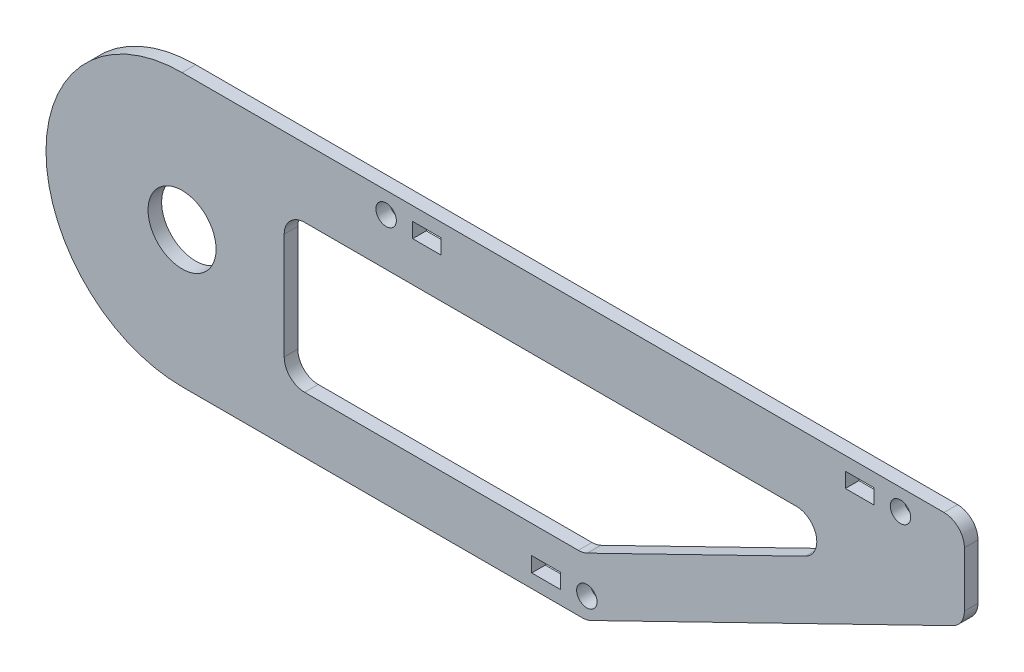
ISO-10303-21;
HEADER;
FILE_DESCRIPTION(('STEP AP214'),'2;1');
FILE_NAME('part.step','',(''),(''),'','','');
FILE_SCHEMA(('AUTOMOTIVE_DESIGN { 1 0 10303 214 1 1 1 1 }'));
ENDSEC;
DATA;
#1=APPLICATION_CONTEXT('core data for automotive mechanical design processes');
#2=APPLICATION_PROTOCOL_DEFINITION('international standard','automotive_design',2000,#1);
#3=PRODUCT_CONTEXT('',#1,'mechanical');
#4=PRODUCT('Part','Part','',(#3));
#5=PRODUCT_RELATED_PRODUCT_CATEGORY('part','',(#4));
#6=PRODUCT_DEFINITION_FORMATION('','',#4);
#7=PRODUCT_DEFINITION_CONTEXT('part definition',#1,'design');
#8=PRODUCT_DEFINITION('design','',#6,#7);
#9=PRODUCT_DEFINITION_SHAPE('','',#8);
#10=(LENGTH_UNIT() NAMED_UNIT(*) SI_UNIT(.MILLI.,.METRE.));
#11=(NAMED_UNIT(*) PLANE_ANGLE_UNIT() SI_UNIT($,.RADIAN.));
#12=(NAMED_UNIT(*) SI_UNIT($,.STERADIAN.) SOLID_ANGLE_UNIT());
#13=UNCERTAINTY_MEASURE_WITH_UNIT(LENGTH_MEASURE(1.E-05),#10,'distance_accuracy_value','');
#14=(GEOMETRIC_REPRESENTATION_CONTEXT(3) GLOBAL_UNCERTAINTY_ASSIGNED_CONTEXT((#13)) GLOBAL_UNIT_ASSIGNED_CONTEXT((#10,
#11,#12)) REPRESENTATION_CONTEXT('',''));
#15=CARTESIAN_POINT('',(0.,0.,0.));
#16=DIRECTION('',(0.,0.,1.));
#17=DIRECTION('',(1.,0.,0.));
#18=AXIS2_PLACEMENT_3D('',#15,#16,#17);
#19=CARTESIAN_POINT('',(0.,0.,2.));
#20=DIRECTION('',(0.,0.,-1.));
#21=DIRECTION('',(-1.,0.,0.));
#22=AXIS2_PLACEMENT_3D('',#19,#20,#21);
#23=PLANE('',#22);
#24=CARTESIAN_POINT('',(59.5,-16.9,2.));
#25=DIRECTION('',(0.,0.,1.));
#26=DIRECTION('',(1.,0.,0.));
#27=AXIS2_PLACEMENT_3D('',#24,#25,#26);
#28=CIRCLE('',#27,1.50000000000003);
#29=CARTESIAN_POINT('',(61.,-16.9,2.));
#30=VERTEX_POINT('',#29);
#31=EDGE_CURVE('E257',#30,#30,#28,.T.);
#32=ORIENTED_EDGE('',*,*,#31,.F.);
#33=EDGE_LOOP('',(#32));
#34=FACE_BOUND('',#33,.T.);
#35=DIRECTION('',(0.,-1.,0.));
#36=VECTOR('',#35,1.);
#37=CARTESIAN_POINT('',(33.9000000000001,18.,2.));
#38=LINE('',#37,#36);
#39=CARTESIAN_POINT('',(33.9000000000001,18.,2.));
#40=VERTEX_POINT('',#39);
#41=CARTESIAN_POINT('',(33.9000000000001,15.8,2.));
#42=VERTEX_POINT('',#41);
#43=EDGE_CURVE('E263',#40,#42,#38,.T.);
#44=ORIENTED_EDGE('',*,*,#43,.F.);
#45=DIRECTION('',(-1.,0.,0.));
#46=VECTOR('',#45,1.);
#47=CARTESIAN_POINT('',(33.9000000000001,18.,2.));
#48=LINE('',#47,#46);
#49=CARTESIAN_POINT('',(38.1,18.,2.));
#50=VERTEX_POINT('',#49);
#51=EDGE_CURVE('E271',#50,#40,#48,.T.);
#52=ORIENTED_EDGE('',*,*,#51,.F.);
#53=DIRECTION('',(0.,1.,0.));
#54=VECTOR('',#53,1.);
#55=CARTESIAN_POINT('',(38.1,18.,2.));
#56=LINE('',#55,#54);
#57=CARTESIAN_POINT('',(38.1,15.8,2.));
#58=VERTEX_POINT('',#57);
#59=EDGE_CURVE('E268',#58,#50,#56,.T.);
#60=ORIENTED_EDGE('',*,*,#59,.F.);
#61=DIRECTION('',(1.,0.,0.));
#62=VECTOR('',#61,1.);
#63=CARTESIAN_POINT('',(33.9000000000001,15.8,2.));
#64=LINE('',#63,#62);
#65=EDGE_CURVE('E265',#42,#58,#64,.T.);
#66=ORIENTED_EDGE('',*,*,#65,.F.);
#67=EDGE_LOOP('',(#44,#52,#60,#66));
#68=FACE_BOUND('',#67,.T.);
#69=CARTESIAN_POINT('',(105.6,16.9,2.));
#70=DIRECTION('',(0.,0.,1.));
#71=DIRECTION('',(-1.,0.,0.));
#72=AXIS2_PLACEMENT_3D('',#69,#70,#71);
#73=CIRCLE('',#72,1.50000000000003);
#74=CARTESIAN_POINT('',(104.1,16.9,2.));
#75=VERTEX_POINT('',#74);
#76=EDGE_CURVE('E331',#75,#75,#73,.T.);
#77=ORIENTED_EDGE('',*,*,#76,.F.);
#78=EDGE_LOOP('',(#77));
#79=FACE_BOUND('',#78,.T.);
#80=CARTESIAN_POINT('',(58.2526580542473,-8.69741400655029,2.));
#81=DIRECTION('',(0.,0.,1.));
#82=DIRECTION('',(-1.,0.,0.));
#83=AXIS2_PLACEMENT_3D('',#80,#81,#82);
#84=CIRCLE('',#83,3.);
#85=CARTESIAN_POINT('',(58.2526580542473,-11.6974140065503,2.));
#86=VERTEX_POINT('',#85);
#87=CARTESIAN_POINT('',(59.5675454491414,-11.3939063834631,2.));
#88=VERTEX_POINT('',#87);
#89=EDGE_CURVE('E337',#86,#88,#84,.T.);
#90=ORIENTED_EDGE('',*,*,#89,.F.);
#91=DIRECTION('',(1.,0.,0.));
#92=VECTOR('',#91,1.);
#93=CARTESIAN_POINT('',(18.0131277478828,-11.6974140065503,2.));
#94=LINE('',#93,#92);
#95=CARTESIAN_POINT('',(18.0131277478828,-11.6974140065503,2.));
#96=VERTEX_POINT('',#95);
#97=EDGE_CURVE('E353',#96,#86,#94,.T.);
#98=ORIENTED_EDGE('',*,*,#97,.F.);
#99=CARTESIAN_POINT('',(18.0131277478828,-8.69741400655029,2.));
#100=DIRECTION('',(0.,0.,1.));
#101=DIRECTION('',(1.,0.,0.));
#102=AXIS2_PLACEMENT_3D('',#99,#100,#101);
#103=CIRCLE('',#102,3.);
#104=CARTESIAN_POINT('',(15.0131277478828,-8.69741400655027,2.));
#105=VERTEX_POINT('',#104);
#106=EDGE_CURVE('E350',#105,#96,#103,.T.);
#107=ORIENTED_EDGE('',*,*,#106,.F.);
#108=DIRECTION('',(0.,-1.,0.));
#109=VECTOR('',#108,1.);
#110=CARTESIAN_POINT('',(15.0131277478828,6.93156783963113,2.));
#111=LINE('',#110,#109);
#112=CARTESIAN_POINT('',(15.0131277478828,6.93156783963113,2.));
#113=VERTEX_POINT('',#112);
#114=EDGE_CURVE('E348',#113,#105,#111,.T.);
#115=ORIENTED_EDGE('',*,*,#114,.F.);
#116=CARTESIAN_POINT('',(18.0131277478828,6.93156783963115,2.));
#117=DIRECTION('',(0.,0.,1.));
#118=DIRECTION('',(-1.,0.,0.));
#119=AXIS2_PLACEMENT_3D('',#116,#117,#118);
#120=CIRCLE('',#119,3.);
#121=CARTESIAN_POINT('',(18.0131277478828,9.93156783963115,2.));
#122=VERTEX_POINT('',#121);
#123=EDGE_CURVE('E346',#122,#113,#120,.T.);
#124=ORIENTED_EDGE('',*,*,#123,.F.);
#125=DIRECTION('',(-1.,0.,0.));
#126=VECTOR('',#125,1.);
#127=CARTESIAN_POINT('',(90.3036386711331,9.93156783963116,2.));
#128=LINE('',#127,#126);
#129=CARTESIAN_POINT('',(90.3036386711331,9.93156783963116,2.));
#130=VERTEX_POINT('',#129);
#131=EDGE_CURVE('E344',#130,#122,#128,.T.);
#132=ORIENTED_EDGE('',*,*,#131,.F.);
#133=CARTESIAN_POINT('',(90.3036386711333,6.93156783963116,2.));
#134=DIRECTION('',(0.,0.,1.));
#135=DIRECTION('',(1.,0.,0.));
#136=AXIS2_PLACEMENT_3D('',#133,#134,#135);
#137=CIRCLE('',#136,3.);
#138=CARTESIAN_POINT('',(91.6185260660271,4.23507546271829,2.));
#139=VERTEX_POINT('',#138);
#140=EDGE_CURVE('E342',#139,#130,#137,.T.);
#141=ORIENTED_EDGE('',*,*,#140,.F.);
#142=DIRECTION('',(0.898830792304262,0.438295798298014,0.));
#143=VECTOR('',#142,1.);
#144=CARTESIAN_POINT('',(59.5675454491414,-11.3939063834631,2.));
#145=LINE('',#144,#143);
#146=EDGE_CURVE('E339',#88,#139,#145,.T.);
#147=ORIENTED_EDGE('',*,*,#146,.F.);
#148=EDGE_LOOP('',(#90,#98,#107,#115,#124,#132,#141,#147));
#149=FACE_BOUND('',#148,.T.);
#150=CARTESIAN_POINT('',(0.,0.,2.));
#151=DIRECTION('',(0.,0.,1.));
#152=DIRECTION('',(-1.,0.,0.));
#153=AXIS2_PLACEMENT_3D('',#150,#151,#152);
#154=CIRCLE('',#153,20.);
#155=CARTESIAN_POINT('',(0.,20.,2.));
#156=VERTEX_POINT('',#155);
#157=CARTESIAN_POINT('',(0.,-20.,2.));
#158=VERTEX_POINT('',#157);
#159=EDGE_CURVE('E402',#156,#158,#154,.T.);
#160=ORIENTED_EDGE('',*,*,#159,.T.);
#161=DIRECTION('',(1.,0.,0.));
#162=VECTOR('',#161,1.);
#163=CARTESIAN_POINT('',(0.,-20.,2.));
#164=LINE('',#163,#162);
#165=CARTESIAN_POINT('',(58.8075278744039,-20.,2.));
#166=VERTEX_POINT('',#165);
#167=EDGE_CURVE('E405',#158,#166,#164,.T.);
#168=ORIENTED_EDGE('',*,*,#167,.T.);
#169=CARTESIAN_POINT('',(58.8075278744039,-17.,2.));
#170=DIRECTION('',(0.,0.,1.));
#171=DIRECTION('',(1.,0.,0.));
#172=AXIS2_PLACEMENT_3D('',#169,#170,#171);
#173=CIRCLE('',#172,3.);
#174=CARTESIAN_POINT('',(60.122415269298,-19.6964923769128,2.));
#175=VERTEX_POINT('',#174);
#176=EDGE_CURVE('E408',#166,#175,#173,.T.);
#177=ORIENTED_EDGE('',*,*,#176,.T.);
#178=DIRECTION('',(0.898830792304262,0.438295798298014,0.));
#179=VECTOR('',#178,1.);
#180=CARTESIAN_POINT('',(60.122415269298,-19.6964923769128,2.));
#181=LINE('',#180,#179);
#182=CARTESIAN_POINT('',(113.314887394894,6.24169001886898,2.));
#183=VERTEX_POINT('',#182);
#184=EDGE_CURVE('E410',#175,#183,#181,.T.);
#185=ORIENTED_EDGE('',*,*,#184,.T.);
#186=CARTESIAN_POINT('',(112.,8.93818239578177,2.));
#187=DIRECTION('',(0.,0.,1.));
#188=DIRECTION('',(-1.,0.,0.));
#189=AXIS2_PLACEMENT_3D('',#186,#187,#188);
#190=CIRCLE('',#189,3.);
#191=CARTESIAN_POINT('',(115.,8.93818239578179,2.));
#192=VERTEX_POINT('',#191);
#193=EDGE_CURVE('E412',#183,#192,#190,.T.);
#194=ORIENTED_EDGE('',*,*,#193,.T.);
#195=DIRECTION('',(0.,1.,0.));
#196=VECTOR('',#195,1.);
#197=CARTESIAN_POINT('',(115.,8.93818239578179,2.));
#198=LINE('',#197,#196);
#199=CARTESIAN_POINT('',(115.,17.,2.));
#200=VERTEX_POINT('',#199);
#201=EDGE_CURVE('E414',#192,#200,#198,.T.);
#202=ORIENTED_EDGE('',*,*,#201,.T.);
#203=CARTESIAN_POINT('',(112.,17.,2.));
#204=DIRECTION('',(0.,0.,1.));
#205=DIRECTION('',(1.,0.,0.));
#206=AXIS2_PLACEMENT_3D('',#203,#204,#205);
#207=CIRCLE('',#206,3.);
#208=CARTESIAN_POINT('',(112.,20.,2.));
#209=VERTEX_POINT('',#208);
#210=EDGE_CURVE('E416',#200,#209,#207,.T.);
#211=ORIENTED_EDGE('',*,*,#210,.T.);
#212=DIRECTION('',(-1.,0.,0.));
#213=VECTOR('',#212,1.);
#214=CARTESIAN_POINT('',(0.,20.,2.));
#215=LINE('',#214,#213);
#216=EDGE_CURVE('E418',#209,#156,#215,.T.);
#217=ORIENTED_EDGE('',*,*,#216,.T.);
#218=EDGE_LOOP('',(#160,#168,#177,#185,#194,#202,#211,#217));
#219=FACE_BOUND('',#218,.T.);
#220=CARTESIAN_POINT('',(0.,0.,2.));
#221=DIRECTION('',(0.,0.,1.));
#222=DIRECTION('',(1.,0.,0.));
#223=AXIS2_PLACEMENT_3D('',#220,#221,#222);
#224=CIRCLE('',#223,5.);
#225=CARTESIAN_POINT('',(5.,0.,2.));
#226=VERTEX_POINT('',#225);
#227=EDGE_CURVE('E396',#226,#226,#224,.T.);
#228=ORIENTED_EDGE('',*,*,#227,.F.);
#229=EDGE_LOOP('',(#228));
#230=FACE_BOUND('',#229,.T.);
#231=DIRECTION('',(0.,1.,0.));
#232=VECTOR('',#231,1.);
#233=CARTESIAN_POINT('',(101.7,15.8,2.));
#234=LINE('',#233,#232);
#235=CARTESIAN_POINT('',(101.7,15.8,2.));
#236=VERTEX_POINT('',#235);
#237=CARTESIAN_POINT('',(101.7,18.,2.));
#238=VERTEX_POINT('',#237);
#239=EDGE_CURVE('E300',#236,#238,#234,.T.);
#240=ORIENTED_EDGE('',*,*,#239,.F.);
#241=DIRECTION('',(1.,0.,0.));
#242=VECTOR('',#241,1.);
#243=CARTESIAN_POINT('',(101.7,15.8,2.));
#244=LINE('',#243,#242);
#245=CARTESIAN_POINT('',(97.5,15.8,2.));
#246=VERTEX_POINT('',#245);
#247=EDGE_CURVE('E308',#246,#236,#244,.T.);
#248=ORIENTED_EDGE('',*,*,#247,.F.);
#249=DIRECTION('',(0.,-1.,0.));
#250=VECTOR('',#249,1.);
#251=CARTESIAN_POINT('',(97.5,15.8,2.));
#252=LINE('',#251,#250);
#253=CARTESIAN_POINT('',(97.4999999999999,18.,2.));
#254=VERTEX_POINT('',#253);
#255=EDGE_CURVE('E305',#254,#246,#252,.T.);
#256=ORIENTED_EDGE('',*,*,#255,.F.);
#257=DIRECTION('',(-1.,0.,0.));
#258=VECTOR('',#257,1.);
#259=CARTESIAN_POINT('',(101.7,18.,2.));
#260=LINE('',#259,#258);
#261=EDGE_CURVE('E302',#238,#254,#260,.T.);
#262=ORIENTED_EDGE('',*,*,#261,.F.);
#263=EDGE_LOOP('',(#240,#248,#256,#262));
#264=FACE_BOUND('',#263,.T.);
#265=CARTESIAN_POINT('',(30.,16.9,2.));
#266=DIRECTION('',(0.,0.,1.));
#267=DIRECTION('',(-1.,0.,0.));
#268=AXIS2_PLACEMENT_3D('',#265,#266,#267);
#269=CIRCLE('',#268,1.50000000000002);
#270=CARTESIAN_POINT('',(28.5,16.9,2.));
#271=VERTEX_POINT('',#270);
#272=EDGE_CURVE('E294',#271,#271,#269,.T.);
#273=ORIENTED_EDGE('',*,*,#272,.F.);
#274=EDGE_LOOP('',(#273));
#275=FACE_BOUND('',#274,.T.);
#276=DIRECTION('',(-1.,0.,0.));
#277=VECTOR('',#276,1.);
#278=CARTESIAN_POINT('',(55.5999999999999,-15.8,2.));
#279=LINE('',#278,#277);
#280=CARTESIAN_POINT('',(55.5999999999999,-15.8,2.));
#281=VERTEX_POINT('',#280);
#282=CARTESIAN_POINT('',(51.4,-15.8,2.));
#283=VERTEX_POINT('',#282);
#284=EDGE_CURVE('E221',#281,#283,#279,.T.);
#285=ORIENTED_EDGE('',*,*,#284,.F.);
#286=DIRECTION('',(0.,1.,0.));
#287=VECTOR('',#286,1.);
#288=CARTESIAN_POINT('',(55.5999999999999,-15.8,2.));
#289=LINE('',#288,#287);
#290=CARTESIAN_POINT('',(55.5999999999999,-18.,2.));
#291=VERTEX_POINT('',#290);
#292=EDGE_CURVE('E243',#291,#281,#289,.T.);
#293=ORIENTED_EDGE('',*,*,#292,.F.);
#294=DIRECTION('',(1.,0.,0.));
#295=VECTOR('',#294,1.);
#296=CARTESIAN_POINT('',(55.5999999999999,-18.,2.));
#297=LINE('',#296,#295);
#298=CARTESIAN_POINT('',(51.4,-18.,2.));
#299=VERTEX_POINT('',#298);
#300=EDGE_CURVE('E241',#299,#291,#297,.T.);
#301=ORIENTED_EDGE('',*,*,#300,.F.);
#302=DIRECTION('',(0.,-1.,0.));
#303=VECTOR('',#302,1.);
#304=CARTESIAN_POINT('',(51.4,-15.8,2.));
#305=LINE('',#304,#303);
#306=EDGE_CURVE('E229',#283,#299,#305,.T.);
#307=ORIENTED_EDGE('',*,*,#306,.F.);
#308=EDGE_LOOP('',(#285,#293,#301,#307));
#309=FACE_BOUND('',#308,.T.);
#310=ADVANCED_FACE('F36',(#34,#68,#79,#149,#219,#230,#264,#275,#309),#23,.F.);
#311=CARTESIAN_POINT('',(0.,0.,0.));
#312=DIRECTION('',(0.,0.,-1.));
#313=DIRECTION('',(-1.,0.,0.));
#314=AXIS2_PLACEMENT_3D('',#311,#312,#313);
#315=PLANE('',#314);
#316=DIRECTION('',(-1.,0.,0.));
#317=VECTOR('',#316,1.);
#318=CARTESIAN_POINT('',(33.9000000000001,18.,0.));
#319=LINE('',#318,#317);
#320=CARTESIAN_POINT('',(38.1,18.,0.));
#321=VERTEX_POINT('',#320);
#322=CARTESIAN_POINT('',(33.9000000000001,18.,0.));
#323=VERTEX_POINT('',#322);
#324=EDGE_CURVE('E266',#321,#323,#319,.T.);
#325=ORIENTED_EDGE('',*,*,#324,.T.);
#326=DIRECTION('',(0.,-1.,0.));
#327=VECTOR('',#326,1.);
#328=CARTESIAN_POINT('',(33.9000000000001,18.,0.));
#329=LINE('',#328,#327);
#330=CARTESIAN_POINT('',(33.9000000000001,15.8,0.));
#331=VERTEX_POINT('',#330);
#332=EDGE_CURVE('E260',#323,#331,#329,.T.);
#333=ORIENTED_EDGE('',*,*,#332,.T.);
#334=DIRECTION('',(1.,0.,0.));
#335=VECTOR('',#334,1.);
#336=CARTESIAN_POINT('',(33.9000000000001,15.8,0.));
#337=LINE('',#336,#335);
#338=CARTESIAN_POINT('',(38.1,15.8,0.));
#339=VERTEX_POINT('',#338);
#340=EDGE_CURVE('E276',#331,#339,#337,.T.);
#341=ORIENTED_EDGE('',*,*,#340,.T.);
#342=DIRECTION('',(0.,1.,0.));
#343=VECTOR('',#342,1.);
#344=CARTESIAN_POINT('',(38.1,18.,0.));
#345=LINE('',#344,#343);
#346=EDGE_CURVE('E279',#339,#321,#345,.T.);
#347=ORIENTED_EDGE('',*,*,#346,.T.);
#348=EDGE_LOOP('',(#325,#333,#341,#347));
#349=FACE_BOUND('',#348,.T.);
#350=CARTESIAN_POINT('',(30.,16.9,0.));
#351=DIRECTION('',(0.,0.,1.));
#352=DIRECTION('',(-1.,0.,0.));
#353=AXIS2_PLACEMENT_3D('',#350,#351,#352);
#354=CIRCLE('',#353,1.50000000000002);
#355=CARTESIAN_POINT('',(28.5,16.9,0.));
#356=VERTEX_POINT('',#355);
#357=EDGE_CURVE('E293',#356,#356,#354,.T.);
#358=ORIENTED_EDGE('',*,*,#357,.T.);
#359=EDGE_LOOP('',(#358));
#360=FACE_BOUND('',#359,.T.);
#361=DIRECTION('',(1.,0.,0.));
#362=VECTOR('',#361,1.);
#363=CARTESIAN_POINT('',(18.0131277478828,-11.6974140065503,0.));
#364=LINE('',#363,#362);
#365=CARTESIAN_POINT('',(18.0131277478828,-11.6974140065503,0.));
#366=VERTEX_POINT('',#365);
#367=CARTESIAN_POINT('',(58.2526580542473,-11.6974140065503,0.));
#368=VERTEX_POINT('',#367);
#369=EDGE_CURVE('E340',#366,#368,#364,.T.);
#370=ORIENTED_EDGE('',*,*,#369,.T.);
#371=CARTESIAN_POINT('',(58.2526580542473,-8.69741400655029,0.));
#372=DIRECTION('',(0.,0.,1.));
#373=DIRECTION('',(-1.,0.,0.));
#374=AXIS2_PLACEMENT_3D('',#371,#372,#373);
#375=CIRCLE('',#374,3.);
#376=CARTESIAN_POINT('',(59.5675454491414,-11.3939063834631,0.));
#377=VERTEX_POINT('',#376);
#378=EDGE_CURVE('E334',#368,#377,#375,.T.);
#379=ORIENTED_EDGE('',*,*,#378,.T.);
#380=DIRECTION('',(0.898830792304262,0.438295798298014,0.));
#381=VECTOR('',#380,1.);
#382=CARTESIAN_POINT('',(59.5675454491414,-11.3939063834631,0.));
#383=LINE('',#382,#381);
#384=CARTESIAN_POINT('',(91.6185260660271,4.23507546271829,0.));
#385=VERTEX_POINT('',#384);
#386=EDGE_CURVE('E358',#377,#385,#383,.T.);
#387=ORIENTED_EDGE('',*,*,#386,.T.);
#388=CARTESIAN_POINT('',(90.3036386711333,6.93156783963116,0.));
#389=DIRECTION('',(0.,0.,1.));
#390=DIRECTION('',(1.,0.,0.));
#391=AXIS2_PLACEMENT_3D('',#388,#389,#390);
#392=CIRCLE('',#391,3.);
#393=CARTESIAN_POINT('',(90.3036386711331,9.93156783963116,0.));
#394=VERTEX_POINT('',#393);
#395=EDGE_CURVE('E361',#385,#394,#392,.T.);
#396=ORIENTED_EDGE('',*,*,#395,.T.);
#397=DIRECTION('',(-1.,0.,0.));
#398=VECTOR('',#397,1.);
#399=CARTESIAN_POINT('',(90.3036386711331,9.93156783963116,0.));
#400=LINE('',#399,#398);
#401=CARTESIAN_POINT('',(18.0131277478828,9.93156783963115,0.));
#402=VERTEX_POINT('',#401);
#403=EDGE_CURVE('E364',#394,#402,#400,.T.);
#404=ORIENTED_EDGE('',*,*,#403,.T.);
#405=CARTESIAN_POINT('',(18.0131277478828,6.93156783963115,0.));
#406=DIRECTION('',(0.,0.,1.));
#407=DIRECTION('',(-1.,0.,0.));
#408=AXIS2_PLACEMENT_3D('',#405,#406,#407);
#409=CIRCLE('',#408,3.);
#410=CARTESIAN_POINT('',(15.0131277478828,6.93156783963113,0.));
#411=VERTEX_POINT('',#410);
#412=EDGE_CURVE('E367',#402,#411,#409,.T.);
#413=ORIENTED_EDGE('',*,*,#412,.T.);
#414=DIRECTION('',(0.,-1.,0.));
#415=VECTOR('',#414,1.);
#416=CARTESIAN_POINT('',(15.0131277478828,6.93156783963113,0.));
#417=LINE('',#416,#415);
#418=CARTESIAN_POINT('',(15.0131277478828,-8.69741400655027,0.));
#419=VERTEX_POINT('',#418);
#420=EDGE_CURVE('E370',#411,#419,#417,.T.);
#421=ORIENTED_EDGE('',*,*,#420,.T.);
#422=CARTESIAN_POINT('',(18.0131277478828,-8.69741400655029,0.));
#423=DIRECTION('',(0.,0.,1.));
#424=DIRECTION('',(1.,0.,0.));
#425=AXIS2_PLACEMENT_3D('',#422,#423,#424);
#426=CIRCLE('',#425,3.);
#427=EDGE_CURVE('E373',#419,#366,#426,.T.);
#428=ORIENTED_EDGE('',*,*,#427,.T.);
#429=EDGE_LOOP('',(#370,#379,#387,#396,#404,#413,#421,#428));
#430=FACE_BOUND('',#429,.T.);
#431=CARTESIAN_POINT('',(0.,0.,0.));
#432=DIRECTION('',(0.,0.,1.));
#433=DIRECTION('',(1.,0.,0.));
#434=AXIS2_PLACEMENT_3D('',#431,#432,#433);
#435=CIRCLE('',#434,5.);
#436=CARTESIAN_POINT('',(5.,0.,0.));
#437=VERTEX_POINT('',#436);
#438=EDGE_CURVE('E395',#437,#437,#435,.T.);
#439=ORIENTED_EDGE('',*,*,#438,.T.);
#440=EDGE_LOOP('',(#439));
#441=FACE_BOUND('',#440,.T.);
#442=CARTESIAN_POINT('',(0.,0.,0.));
#443=DIRECTION('',(0.,0.,1.));
#444=DIRECTION('',(-1.,0.,0.));
#445=AXIS2_PLACEMENT_3D('',#442,#443,#444);
#446=CIRCLE('',#445,20.);
#447=CARTESIAN_POINT('',(0.,20.,0.));
#448=VERTEX_POINT('',#447);
#449=CARTESIAN_POINT('',(0.,-20.,0.));
#450=VERTEX_POINT('',#449);
#451=EDGE_CURVE('E399',#448,#450,#446,.T.);
#452=ORIENTED_EDGE('',*,*,#451,.F.);
#453=DIRECTION('',(-1.,0.,0.));
#454=VECTOR('',#453,1.);
#455=CARTESIAN_POINT('',(0.,20.,0.));
#456=LINE('',#455,#454);
#457=CARTESIAN_POINT('',(112.,20.,0.));
#458=VERTEX_POINT('',#457);
#459=EDGE_CURVE('E406',#458,#448,#456,.T.);
#460=ORIENTED_EDGE('',*,*,#459,.F.);
#461=CARTESIAN_POINT('',(112.,17.,0.));
#462=DIRECTION('',(0.,0.,1.));
#463=DIRECTION('',(1.,0.,0.));
#464=AXIS2_PLACEMENT_3D('',#461,#462,#463);
#465=CIRCLE('',#464,3.);
#466=CARTESIAN_POINT('',(115.,17.,0.));
#467=VERTEX_POINT('',#466);
#468=EDGE_CURVE('E433',#467,#458,#465,.T.);
#469=ORIENTED_EDGE('',*,*,#468,.F.);
#470=DIRECTION('',(0.,1.,0.));
#471=VECTOR('',#470,1.);
#472=CARTESIAN_POINT('',(115.,8.93818239578179,0.));
#473=LINE('',#472,#471);
#474=CARTESIAN_POINT('',(115.,8.93818239578179,0.));
#475=VERTEX_POINT('',#474);
#476=EDGE_CURVE('E431',#475,#467,#473,.T.);
#477=ORIENTED_EDGE('',*,*,#476,.F.);
#478=CARTESIAN_POINT('',(112.,8.93818239578177,0.));
#479=DIRECTION('',(0.,0.,1.));
#480=DIRECTION('',(-1.,0.,0.));
#481=AXIS2_PLACEMENT_3D('',#478,#479,#480);
#482=CIRCLE('',#481,3.);
#483=CARTESIAN_POINT('',(113.314887394894,6.24169001886898,0.));
#484=VERTEX_POINT('',#483);
#485=EDGE_CURVE('E429',#484,#475,#482,.T.);
#486=ORIENTED_EDGE('',*,*,#485,.F.);
#487=DIRECTION('',(0.898830792304262,0.438295798298014,0.));
#488=VECTOR('',#487,1.);
#489=CARTESIAN_POINT('',(60.122415269298,-19.6964923769128,0.));
#490=LINE('',#489,#488);
#491=CARTESIAN_POINT('',(60.122415269298,-19.6964923769128,0.));
#492=VERTEX_POINT('',#491);
#493=EDGE_CURVE('E427',#492,#484,#490,.T.);
#494=ORIENTED_EDGE('',*,*,#493,.F.);
#495=CARTESIAN_POINT('',(58.8075278744039,-17.,0.));
#496=DIRECTION('',(0.,0.,1.));
#497=DIRECTION('',(1.,0.,0.));
#498=AXIS2_PLACEMENT_3D('',#495,#496,#497);
#499=CIRCLE('',#498,3.);
#500=CARTESIAN_POINT('',(58.8075278744039,-20.,0.));
#501=VERTEX_POINT('',#500);
#502=EDGE_CURVE('E425',#501,#492,#499,.T.);
#503=ORIENTED_EDGE('',*,*,#502,.F.);
#504=DIRECTION('',(1.,0.,0.));
#505=VECTOR('',#504,1.);
#506=CARTESIAN_POINT('',(0.,-20.,0.));
#507=LINE('',#506,#505);
#508=EDGE_CURVE('E423',#450,#501,#507,.T.);
#509=ORIENTED_EDGE('',*,*,#508,.F.);
#510=EDGE_LOOP('',(#452,#460,#469,#477,#486,#494,#503,#509));
#511=FACE_BOUND('',#510,.T.);
#512=CARTESIAN_POINT('',(105.6,16.9,0.));
#513=DIRECTION('',(0.,0.,1.));
#514=DIRECTION('',(-1.,0.,0.));
#515=AXIS2_PLACEMENT_3D('',#512,#513,#514);
#516=CIRCLE('',#515,1.50000000000003);
#517=CARTESIAN_POINT('',(104.1,16.9,0.));
#518=VERTEX_POINT('',#517);
#519=EDGE_CURVE('E330',#518,#518,#516,.T.);
#520=ORIENTED_EDGE('',*,*,#519,.T.);
#521=EDGE_LOOP('',(#520));
#522=FACE_BOUND('',#521,.T.);
#523=DIRECTION('',(1.,0.,0.));
#524=VECTOR('',#523,1.);
#525=CARTESIAN_POINT('',(101.7,15.8,0.));
#526=LINE('',#525,#524);
#527=CARTESIAN_POINT('',(97.5,15.8,0.));
#528=VERTEX_POINT('',#527);
#529=CARTESIAN_POINT('',(101.7,15.8,0.));
#530=VERTEX_POINT('',#529);
#531=EDGE_CURVE('E303',#528,#530,#526,.T.);
#532=ORIENTED_EDGE('',*,*,#531,.T.);
#533=DIRECTION('',(0.,1.,0.));
#534=VECTOR('',#533,1.);
#535=CARTESIAN_POINT('',(101.7,15.8,0.));
#536=LINE('',#535,#534);
#537=CARTESIAN_POINT('',(101.7,18.,0.));
#538=VERTEX_POINT('',#537);
#539=EDGE_CURVE('E297',#530,#538,#536,.T.);
#540=ORIENTED_EDGE('',*,*,#539,.T.);
#541=DIRECTION('',(-1.,0.,0.));
#542=VECTOR('',#541,1.);
#543=CARTESIAN_POINT('',(101.7,18.,0.));
#544=LINE('',#543,#542);
#545=CARTESIAN_POINT('',(97.4999999999999,18.,0.));
#546=VERTEX_POINT('',#545);
#547=EDGE_CURVE('E313',#538,#546,#544,.T.);
#548=ORIENTED_EDGE('',*,*,#547,.T.);
#549=DIRECTION('',(0.,-1.,0.));
#550=VECTOR('',#549,1.);
#551=CARTESIAN_POINT('',(97.5,15.8,0.));
#552=LINE('',#551,#550);
#553=EDGE_CURVE('E316',#546,#528,#552,.T.);
#554=ORIENTED_EDGE('',*,*,#553,.T.);
#555=EDGE_LOOP('',(#532,#540,#548,#554));
#556=FACE_BOUND('',#555,.T.);
#557=CARTESIAN_POINT('',(59.5,-16.9,0.));
#558=DIRECTION('',(0.,0.,1.));
#559=DIRECTION('',(1.,0.,0.));
#560=AXIS2_PLACEMENT_3D('',#557,#558,#559);
#561=CIRCLE('',#560,1.50000000000003);
#562=CARTESIAN_POINT('',(61.,-16.9,0.));
#563=VERTEX_POINT('',#562);
#564=EDGE_CURVE('E237',#563,#563,#561,.T.);
#565=ORIENTED_EDGE('',*,*,#564,.T.);
#566=EDGE_LOOP('',(#565));
#567=FACE_BOUND('',#566,.T.);
#568=DIRECTION('',(0.,1.,0.));
#569=VECTOR('',#568,1.);
#570=CARTESIAN_POINT('',(55.5999999999999,-15.8,0.));
#571=LINE('',#570,#569);
#572=CARTESIAN_POINT('',(55.5999999999999,-18.,0.));
#573=VERTEX_POINT('',#572);
#574=CARTESIAN_POINT('',(55.5999999999999,-15.8,0.));
#575=VERTEX_POINT('',#574);
#576=EDGE_CURVE('E230',#573,#575,#571,.T.);
#577=ORIENTED_EDGE('',*,*,#576,.T.);
#578=DIRECTION('',(-1.,0.,0.));
#579=VECTOR('',#578,1.);
#580=CARTESIAN_POINT('',(55.5999999999999,-15.8,0.));
#581=LINE('',#580,#579);
#582=CARTESIAN_POINT('',(51.4,-15.8,0.));
#583=VERTEX_POINT('',#582);
#584=EDGE_CURVE('E59',#575,#583,#581,.T.);
#585=ORIENTED_EDGE('',*,*,#584,.T.);
#586=DIRECTION('',(0.,-1.,0.));
#587=VECTOR('',#586,1.);
#588=CARTESIAN_POINT('',(51.4,-15.8,0.));
#589=LINE('',#588,#587);
#590=CARTESIAN_POINT('',(51.4,-18.,0.));
#591=VERTEX_POINT('',#590);
#592=EDGE_CURVE('E236',#583,#591,#589,.T.);
#593=ORIENTED_EDGE('',*,*,#592,.T.);
#594=DIRECTION('',(1.,0.,0.));
#595=VECTOR('',#594,1.);
#596=CARTESIAN_POINT('',(55.5999999999999,-18.,0.));
#597=LINE('',#596,#595);
#598=EDGE_CURVE('E249',#591,#573,#597,.T.);
#599=ORIENTED_EDGE('',*,*,#598,.T.);
#600=EDGE_LOOP('',(#577,#585,#593,#599));
#601=FACE_BOUND('',#600,.T.);
#602=ADVANCED_FACE('F463',(#349,#360,#430,#441,#511,#522,#556,#567,#601),#315,.T.);
#603=CARTESIAN_POINT('',(0.,0.,2.));
#604=DIRECTION('',(0.,0.,-1.));
#605=DIRECTION('',(-1.,0.,0.));
#606=AXIS2_PLACEMENT_3D('',#603,#604,#605);
#607=CYLINDRICAL_SURFACE('',#606,20.);
#608=ORIENTED_EDGE('',*,*,#451,.T.);
#609=DIRECTION('',(0.,0.,-1.));
#610=VECTOR('',#609,1.);
#611=CARTESIAN_POINT('',(0.,-20.,2.));
#612=LINE('',#611,#610);
#613=EDGE_CURVE('E11',#158,#450,#612,.T.);
#614=ORIENTED_EDGE('',*,*,#613,.F.);
#615=ORIENTED_EDGE('',*,*,#159,.F.);
#616=DIRECTION('',(0.,0.,-1.));
#617=VECTOR('',#616,1.);
#618=CARTESIAN_POINT('',(0.,20.,2.));
#619=LINE('',#618,#617);
#620=EDGE_CURVE('E420',#156,#448,#619,.T.);
#621=ORIENTED_EDGE('',*,*,#620,.T.);
#622=EDGE_LOOP('',(#608,#614,#615,#621));
#623=FACE_BOUND('',#622,.T.);
#624=ADVANCED_FACE('F38',(#623),#607,.T.);
#625=CARTESIAN_POINT('',(0.,-20.,2.));
#626=DIRECTION('',(0.,1.,0.));
#627=DIRECTION('',(-1.,0.,0.));
#628=AXIS2_PLACEMENT_3D('',#625,#626,#627);
#629=PLANE('',#628);
#630=ORIENTED_EDGE('',*,*,#508,.T.);
#631=DIRECTION('',(0.,0.,-1.));
#632=VECTOR('',#631,1.);
#633=CARTESIAN_POINT('',(58.8075278744039,-20.,2.));
#634=LINE('',#633,#632);
#635=EDGE_CURVE('E44',#166,#501,#634,.T.);
#636=ORIENTED_EDGE('',*,*,#635,.F.);
#637=ORIENTED_EDGE('',*,*,#167,.F.);
#638=ORIENTED_EDGE('',*,*,#613,.T.);
#639=EDGE_LOOP('',(#630,#636,#637,#638));
#640=FACE_BOUND('',#639,.T.);
#641=ADVANCED_FACE('F481',(#640),#629,.F.);
#642=CARTESIAN_POINT('',(58.8075278744039,-17.,2.));
#643=DIRECTION('',(0.,0.,-1.));
#644=DIRECTION('',(-1.,0.,0.));
#645=AXIS2_PLACEMENT_3D('',#642,#643,#644);
#646=CYLINDRICAL_SURFACE('',#645,3.);
#647=ORIENTED_EDGE('',*,*,#502,.T.);
#648=DIRECTION('',(0.,0.,-1.));
#649=VECTOR('',#648,1.);
#650=CARTESIAN_POINT('',(60.122415269298,-19.6964923769128,2.));
#651=LINE('',#650,#649);
#652=EDGE_CURVE('E450',#175,#492,#651,.T.);
#653=ORIENTED_EDGE('',*,*,#652,.F.);
#654=ORIENTED_EDGE('',*,*,#176,.F.);
#655=ORIENTED_EDGE('',*,*,#635,.T.);
#656=EDGE_LOOP('',(#647,#653,#654,#655));
#657=FACE_BOUND('',#656,.T.);
#658=ADVANCED_FACE('F457',(#657),#646,.T.);
#659=CARTESIAN_POINT('',(60.122415269298,-19.6964923769128,2.));
#660=DIRECTION('',(-0.438295798298014,0.898830792304262,0.));
#661=DIRECTION('',(-0.898830792304262,-0.438295798298014,0.));
#662=AXIS2_PLACEMENT_3D('',#659,#660,#661);
#663=PLANE('',#662);
#664=ORIENTED_EDGE('',*,*,#493,.T.);
#665=DIRECTION('',(0.,0.,-1.));
#666=VECTOR('',#665,1.);
#667=CARTESIAN_POINT('',(113.314887394894,6.24169001886898,2.));
#668=LINE('',#667,#666);
#669=EDGE_CURVE('E447',#183,#484,#668,.T.);
#670=ORIENTED_EDGE('',*,*,#669,.F.);
#671=ORIENTED_EDGE('',*,*,#184,.F.);
#672=ORIENTED_EDGE('',*,*,#652,.T.);
#673=EDGE_LOOP('',(#664,#670,#671,#672));
#674=FACE_BOUND('',#673,.T.);
#675=ADVANCED_FACE('F469',(#674),#663,.F.);
#676=CARTESIAN_POINT('',(112.,8.93818239578177,2.));
#677=DIRECTION('',(0.,0.,-1.));
#678=DIRECTION('',(-1.,0.,0.));
#679=AXIS2_PLACEMENT_3D('',#676,#677,#678);
#680=CYLINDRICAL_SURFACE('',#679,3.);
#681=ORIENTED_EDGE('',*,*,#485,.T.);
#682=DIRECTION('',(0.,0.,-1.));
#683=VECTOR('',#682,1.);
#684=CARTESIAN_POINT('',(115.,8.93818239578179,2.));
#685=LINE('',#684,#683);
#686=EDGE_CURVE('E444',#192,#475,#685,.T.);
#687=ORIENTED_EDGE('',*,*,#686,.F.);
#688=ORIENTED_EDGE('',*,*,#193,.F.);
#689=ORIENTED_EDGE('',*,*,#669,.T.);
#690=EDGE_LOOP('',(#681,#687,#688,#689));
#691=FACE_BOUND('',#690,.T.);
#692=ADVANCED_FACE('F473',(#691),#680,.T.);
#693=CARTESIAN_POINT('',(115.,8.93818239578179,2.));
#694=DIRECTION('',(-1.,0.,0.));
#695=DIRECTION('',(0.,-1.,0.));
#696=AXIS2_PLACEMENT_3D('',#693,#694,#695);
#697=PLANE('',#696);
#698=ORIENTED_EDGE('',*,*,#476,.T.);
#699=DIRECTION('',(0.,0.,-1.));
#700=VECTOR('',#699,1.);
#701=CARTESIAN_POINT('',(115.,17.,2.));
#702=LINE('',#701,#700);
#703=EDGE_CURVE('E441',#200,#467,#702,.T.);
#704=ORIENTED_EDGE('',*,*,#703,.F.);
#705=ORIENTED_EDGE('',*,*,#201,.F.);
#706=ORIENTED_EDGE('',*,*,#686,.T.);
#707=EDGE_LOOP('',(#698,#704,#705,#706));
#708=FACE_BOUND('',#707,.T.);
#709=ADVANCED_FACE('F494',(#708),#697,.F.);
#710=CARTESIAN_POINT('',(112.,17.,2.));
#711=DIRECTION('',(0.,0.,-1.));
#712=DIRECTION('',(-1.,0.,0.));
#713=AXIS2_PLACEMENT_3D('',#710,#711,#712);
#714=CYLINDRICAL_SURFACE('',#713,3.);
#715=ORIENTED_EDGE('',*,*,#468,.T.);
#716=DIRECTION('',(0.,0.,-1.));
#717=VECTOR('',#716,1.);
#718=CARTESIAN_POINT('',(112.,20.,2.));
#719=LINE('',#718,#717);
#720=EDGE_CURVE('E438',#209,#458,#719,.T.);
#721=ORIENTED_EDGE('',*,*,#720,.F.);
#722=ORIENTED_EDGE('',*,*,#210,.F.);
#723=ORIENTED_EDGE('',*,*,#703,.T.);
#724=EDGE_LOOP('',(#715,#721,#722,#723));
#725=FACE_BOUND('',#724,.T.);
#726=ADVANCED_FACE('F492',(#725),#714,.T.);
#727=CARTESIAN_POINT('',(0.,20.,2.));
#728=DIRECTION('',(0.,-1.,0.));
#729=DIRECTION('',(1.,0.,0.));
#730=AXIS2_PLACEMENT_3D('',#727,#728,#729);
#731=PLANE('',#730);
#732=ORIENTED_EDGE('',*,*,#459,.T.);
#733=ORIENTED_EDGE('',*,*,#620,.F.);
#734=ORIENTED_EDGE('',*,*,#216,.F.);
#735=ORIENTED_EDGE('',*,*,#720,.T.);
#736=EDGE_LOOP('',(#732,#733,#734,#735));
#737=FACE_BOUND('',#736,.T.);
#738=ADVANCED_FACE('F487',(#737),#731,.F.);
#739=CARTESIAN_POINT('',(0.,0.,2.));
#740=DIRECTION('',(0.,0.,-1.));
#741=DIRECTION('',(-1.,0.,0.));
#742=AXIS2_PLACEMENT_3D('',#739,#740,#741);
#743=CYLINDRICAL_SURFACE('',#742,5.);
#744=ORIENTED_EDGE('',*,*,#227,.T.);
#745=EDGE_LOOP('',(#744));
#746=FACE_BOUND('',#745,.T.);
#747=ORIENTED_EDGE('',*,*,#438,.F.);
#748=EDGE_LOOP('',(#747));
#749=FACE_BOUND('',#748,.T.);
#750=ADVANCED_FACE('F514',(#746,#749),#743,.F.);
#751=CARTESIAN_POINT('',(58.2526580542473,-8.69741400655029,2.));
#752=DIRECTION('',(0.,0.,-1.));
#753=DIRECTION('',(-1.,0.,0.));
#754=AXIS2_PLACEMENT_3D('',#751,#752,#753);
#755=CYLINDRICAL_SURFACE('',#754,3.);
#756=ORIENTED_EDGE('',*,*,#378,.F.);
#757=DIRECTION('',(0.,0.,-1.));
#758=VECTOR('',#757,1.);
#759=CARTESIAN_POINT('',(58.2526580542473,-11.6974140065503,2.));
#760=LINE('',#759,#758);
#761=EDGE_CURVE('E355',#86,#368,#760,.T.);
#762=ORIENTED_EDGE('',*,*,#761,.F.);
#763=ORIENTED_EDGE('',*,*,#89,.T.);
#764=DIRECTION('',(0.,0.,-1.));
#765=VECTOR('',#764,1.);
#766=CARTESIAN_POINT('',(59.5675454491414,-11.3939063834631,2.));
#767=LINE('',#766,#765);
#768=EDGE_CURVE('E392',#88,#377,#767,.T.);
#769=ORIENTED_EDGE('',*,*,#768,.T.);
#770=EDGE_LOOP('',(#756,#762,#763,#769));
#771=FACE_BOUND('',#770,.T.);
#772=ADVANCED_FACE('F521',(#771),#755,.F.);
#773=CARTESIAN_POINT('',(59.5675454491414,-11.3939063834631,2.));
#774=DIRECTION('',(-0.438295798298014,0.898830792304262,0.));
#775=DIRECTION('',(-0.898830792304262,-0.438295798298014,0.));
#776=AXIS2_PLACEMENT_3D('',#773,#774,#775);
#777=PLANE('',#776);
#778=ORIENTED_EDGE('',*,*,#386,.F.);
#779=ORIENTED_EDGE('',*,*,#768,.F.);
#780=ORIENTED_EDGE('',*,*,#146,.T.);
#781=DIRECTION('',(0.,0.,-1.));
#782=VECTOR('',#781,1.);
#783=CARTESIAN_POINT('',(91.6185260660271,4.23507546271829,2.));
#784=LINE('',#783,#782);
#785=EDGE_CURVE('E390',#139,#385,#784,.T.);
#786=ORIENTED_EDGE('',*,*,#785,.T.);
#787=EDGE_LOOP('',(#778,#779,#780,#786));
#788=FACE_BOUND('',#787,.T.);
#789=ADVANCED_FACE('F526',(#788),#777,.T.);
#790=CARTESIAN_POINT('',(90.3036386711333,6.93156783963116,2.));
#791=DIRECTION('',(0.,0.,-1.));
#792=DIRECTION('',(-1.,0.,0.));
#793=AXIS2_PLACEMENT_3D('',#790,#791,#792);
#794=CYLINDRICAL_SURFACE('',#793,3.);
#795=ORIENTED_EDGE('',*,*,#395,.F.);
#796=ORIENTED_EDGE('',*,*,#785,.F.);
#797=ORIENTED_EDGE('',*,*,#140,.T.);
#798=DIRECTION('',(0.,0.,-1.));
#799=VECTOR('',#798,1.);
#800=CARTESIAN_POINT('',(90.3036386711331,9.93156783963116,2.));
#801=LINE('',#800,#799);
#802=EDGE_CURVE('E388',#130,#394,#801,.T.);
#803=ORIENTED_EDGE('',*,*,#802,.T.);
#804=EDGE_LOOP('',(#795,#796,#797,#803));
#805=FACE_BOUND('',#804,.T.);
#806=ADVANCED_FACE('F565',(#805),#794,.F.);
#807=CARTESIAN_POINT('',(90.3036386711331,9.93156783963116,2.));
#808=DIRECTION('',(0.,-1.,0.));
#809=DIRECTION('',(1.,0.,0.));
#810=AXIS2_PLACEMENT_3D('',#807,#808,#809);
#811=PLANE('',#810);
#812=ORIENTED_EDGE('',*,*,#403,.F.);
#813=ORIENTED_EDGE('',*,*,#802,.F.);
#814=ORIENTED_EDGE('',*,*,#131,.T.);
#815=DIRECTION('',(0.,0.,-1.));
#816=VECTOR('',#815,1.);
#817=CARTESIAN_POINT('',(18.0131277478828,9.93156783963115,2.));
#818=LINE('',#817,#816);
#819=EDGE_CURVE('E386',#122,#402,#818,.T.);
#820=ORIENTED_EDGE('',*,*,#819,.T.);
#821=EDGE_LOOP('',(#812,#813,#814,#820));
#822=FACE_BOUND('',#821,.T.);
#823=ADVANCED_FACE('F570',(#822),#811,.T.);
#824=CARTESIAN_POINT('',(18.0131277478828,6.93156783963115,2.));
#825=DIRECTION('',(0.,0.,-1.));
#826=DIRECTION('',(-1.,0.,0.));
#827=AXIS2_PLACEMENT_3D('',#824,#825,#826);
#828=CYLINDRICAL_SURFACE('',#827,3.);
#829=ORIENTED_EDGE('',*,*,#412,.F.);
#830=ORIENTED_EDGE('',*,*,#819,.F.);
#831=ORIENTED_EDGE('',*,*,#123,.T.);
#832=DIRECTION('',(0.,0.,-1.));
#833=VECTOR('',#832,1.);
#834=CARTESIAN_POINT('',(15.0131277478828,6.93156783963113,2.));
#835=LINE('',#834,#833);
#836=EDGE_CURVE('E384',#113,#411,#835,.T.);
#837=ORIENTED_EDGE('',*,*,#836,.T.);
#838=EDGE_LOOP('',(#829,#830,#831,#837));
#839=FACE_BOUND('',#838,.T.);
#840=ADVANCED_FACE('F574',(#839),#828,.F.);
#841=CARTESIAN_POINT('',(15.0131277478828,6.93156783963113,2.));
#842=DIRECTION('',(1.,0.,0.));
#843=DIRECTION('',(0.,0.,-1.));
#844=AXIS2_PLACEMENT_3D('',#841,#842,#843);
#845=PLANE('',#844);
#846=ORIENTED_EDGE('',*,*,#420,.F.);
#847=ORIENTED_EDGE('',*,*,#836,.F.);
#848=ORIENTED_EDGE('',*,*,#114,.T.);
#849=DIRECTION('',(0.,0.,-1.));
#850=VECTOR('',#849,1.);
#851=CARTESIAN_POINT('',(15.0131277478828,-8.69741400655027,2.));
#852=LINE('',#851,#850);
#853=EDGE_CURVE('E382',#105,#419,#852,.T.);
#854=ORIENTED_EDGE('',*,*,#853,.T.);
#855=EDGE_LOOP('',(#846,#847,#848,#854));
#856=FACE_BOUND('',#855,.T.);
#857=ADVANCED_FACE('F579',(#856),#845,.T.);
#858=CARTESIAN_POINT('',(18.0131277478828,-8.69741400655029,2.));
#859=DIRECTION('',(0.,0.,-1.));
#860=DIRECTION('',(-1.,0.,0.));
#861=AXIS2_PLACEMENT_3D('',#858,#859,#860);
#862=CYLINDRICAL_SURFACE('',#861,3.);
#863=ORIENTED_EDGE('',*,*,#427,.F.);
#864=ORIENTED_EDGE('',*,*,#853,.F.);
#865=ORIENTED_EDGE('',*,*,#106,.T.);
#866=DIRECTION('',(0.,0.,-1.));
#867=VECTOR('',#866,1.);
#868=CARTESIAN_POINT('',(18.0131277478828,-11.6974140065503,2.));
#869=LINE('',#868,#867);
#870=EDGE_CURVE('E380',#96,#366,#869,.T.);
#871=ORIENTED_EDGE('',*,*,#870,.T.);
#872=EDGE_LOOP('',(#863,#864,#865,#871));
#873=FACE_BOUND('',#872,.T.);
#874=ADVANCED_FACE('F582',(#873),#862,.F.);
#875=CARTESIAN_POINT('',(18.0131277478828,-11.6974140065503,2.));
#876=DIRECTION('',(0.,1.,0.));
#877=DIRECTION('',(0.,0.,1.));
#878=AXIS2_PLACEMENT_3D('',#875,#876,#877);
#879=PLANE('',#878);
#880=ORIENTED_EDGE('',*,*,#369,.F.);
#881=ORIENTED_EDGE('',*,*,#870,.F.);
#882=ORIENTED_EDGE('',*,*,#97,.T.);
#883=ORIENTED_EDGE('',*,*,#761,.T.);
#884=EDGE_LOOP('',(#880,#881,#882,#883));
#885=FACE_BOUND('',#884,.T.);
#886=ADVANCED_FACE('F551',(#885),#879,.T.);
#887=CARTESIAN_POINT('',(105.6,16.9,2.));
#888=DIRECTION('',(0.,0.,-1.));
#889=DIRECTION('',(-1.,0.,0.));
#890=AXIS2_PLACEMENT_3D('',#887,#888,#889);
#891=CYLINDRICAL_SURFACE('',#890,1.50000000000003);
#892=ORIENTED_EDGE('',*,*,#76,.T.);
#893=EDGE_LOOP('',(#892));
#894=FACE_BOUND('',#893,.T.);
#895=ORIENTED_EDGE('',*,*,#519,.F.);
#896=EDGE_LOOP('',(#895));
#897=FACE_BOUND('',#896,.T.);
#898=ADVANCED_FACE('F589',(#894,#897),#891,.F.);
#899=CARTESIAN_POINT('',(101.7,15.8,2.));
#900=DIRECTION('',(-1.,0.,0.));
#901=DIRECTION('',(0.,0.,1.));
#902=AXIS2_PLACEMENT_3D('',#899,#900,#901);
#903=PLANE('',#902);
#904=ORIENTED_EDGE('',*,*,#539,.F.);
#905=DIRECTION('',(0.,0.,-1.));
#906=VECTOR('',#905,1.);
#907=CARTESIAN_POINT('',(101.7,15.8,2.));
#908=LINE('',#907,#906);
#909=EDGE_CURVE('E310',#236,#530,#908,.T.);
#910=ORIENTED_EDGE('',*,*,#909,.F.);
#911=ORIENTED_EDGE('',*,*,#239,.T.);
#912=DIRECTION('',(0.,0.,-1.));
#913=VECTOR('',#912,1.);
#914=CARTESIAN_POINT('',(101.7,18.,2.));
#915=LINE('',#914,#913);
#916=EDGE_CURVE('E327',#238,#538,#915,.T.);
#917=ORIENTED_EDGE('',*,*,#916,.T.);
#918=EDGE_LOOP('',(#904,#910,#911,#917));
#919=FACE_BOUND('',#918,.T.);
#920=ADVANCED_FACE('F640',(#919),#903,.T.);
#921=CARTESIAN_POINT('',(101.7,18.,2.));
#922=DIRECTION('',(0.,-1.,0.));
#923=DIRECTION('',(1.,0.,0.));
#924=AXIS2_PLACEMENT_3D('',#921,#922,#923);
#925=PLANE('',#924);
#926=ORIENTED_EDGE('',*,*,#547,.F.);
#927=ORIENTED_EDGE('',*,*,#916,.F.);
#928=ORIENTED_EDGE('',*,*,#261,.T.);
#929=DIRECTION('',(0.,0.,-1.));
#930=VECTOR('',#929,1.);
#931=CARTESIAN_POINT('',(97.4999999999999,18.,2.));
#932=LINE('',#931,#930);
#933=EDGE_CURVE('E325',#254,#546,#932,.T.);
#934=ORIENTED_EDGE('',*,*,#933,.T.);
#935=EDGE_LOOP('',(#926,#927,#928,#934));
#936=FACE_BOUND('',#935,.T.);
#937=ADVANCED_FACE('F649',(#936),#925,.T.);
#938=CARTESIAN_POINT('',(97.5,15.8,2.));
#939=DIRECTION('',(1.,0.,0.));
#940=DIRECTION('',(0.,1.,0.));
#941=AXIS2_PLACEMENT_3D('',#938,#939,#940);
#942=PLANE('',#941);
#943=ORIENTED_EDGE('',*,*,#553,.F.);
#944=ORIENTED_EDGE('',*,*,#933,.F.);
#945=ORIENTED_EDGE('',*,*,#255,.T.);
#946=DIRECTION('',(0.,0.,-1.));
#947=VECTOR('',#946,1.);
#948=CARTESIAN_POINT('',(97.5,15.8,2.));
#949=LINE('',#948,#947);
#950=EDGE_CURVE('E323',#246,#528,#949,.T.);
#951=ORIENTED_EDGE('',*,*,#950,.T.);
#952=EDGE_LOOP('',(#943,#944,#945,#951));
#953=FACE_BOUND('',#952,.T.);
#954=ADVANCED_FACE('F659',(#953),#942,.T.);
#955=CARTESIAN_POINT('',(101.7,15.8,2.));
#956=DIRECTION('',(0.,1.,0.));
#957=DIRECTION('',(-1.,0.,0.));
#958=AXIS2_PLACEMENT_3D('',#955,#956,#957);
#959=PLANE('',#958);
#960=ORIENTED_EDGE('',*,*,#531,.F.);
#961=ORIENTED_EDGE('',*,*,#950,.F.);
#962=ORIENTED_EDGE('',*,*,#247,.T.);
#963=ORIENTED_EDGE('',*,*,#909,.T.);
#964=EDGE_LOOP('',(#960,#961,#962,#963));
#965=FACE_BOUND('',#964,.T.);
#966=ADVANCED_FACE('F543',(#965),#959,.T.);
#967=CARTESIAN_POINT('',(30.,16.9,2.));
#968=DIRECTION('',(0.,0.,-1.));
#969=DIRECTION('',(-1.,0.,0.));
#970=AXIS2_PLACEMENT_3D('',#967,#968,#969);
#971=CYLINDRICAL_SURFACE('',#970,1.50000000000002);
#972=ORIENTED_EDGE('',*,*,#272,.T.);
#973=EDGE_LOOP('',(#972));
#974=FACE_BOUND('',#973,.T.);
#975=ORIENTED_EDGE('',*,*,#357,.F.);
#976=EDGE_LOOP('',(#975));
#977=FACE_BOUND('',#976,.T.);
#978=ADVANCED_FACE('F539',(#974,#977),#971,.F.);
#979=CARTESIAN_POINT('',(33.9000000000001,18.,2.));
#980=DIRECTION('',(1.,0.,0.));
#981=DIRECTION('',(0.,0.,-1.));
#982=AXIS2_PLACEMENT_3D('',#979,#980,#981);
#983=PLANE('',#982);
#984=ORIENTED_EDGE('',*,*,#332,.F.);
#985=DIRECTION('',(0.,0.,-1.));
#986=VECTOR('',#985,1.);
#987=CARTESIAN_POINT('',(33.9000000000001,18.,2.));
#988=LINE('',#987,#986);
#989=EDGE_CURVE('E273',#40,#323,#988,.T.);
#990=ORIENTED_EDGE('',*,*,#989,.F.);
#991=ORIENTED_EDGE('',*,*,#43,.T.);
#992=DIRECTION('',(0.,0.,-1.));
#993=VECTOR('',#992,1.);
#994=CARTESIAN_POINT('',(33.9000000000001,15.8,2.));
#995=LINE('',#994,#993);
#996=EDGE_CURVE('E290',#42,#331,#995,.T.);
#997=ORIENTED_EDGE('',*,*,#996,.T.);
#998=EDGE_LOOP('',(#984,#990,#991,#997));
#999=FACE_BOUND('',#998,.T.);
#1000=ADVANCED_FACE('F542',(#999),#983,.T.);
#1001=CARTESIAN_POINT('',(33.9000000000001,15.8,2.));
#1002=DIRECTION('',(0.,1.,0.));
#1003=DIRECTION('',(0.,0.,1.));
#1004=AXIS2_PLACEMENT_3D('',#1001,#1002,#1003);
#1005=PLANE('',#1004);
#1006=ORIENTED_EDGE('',*,*,#340,.F.);
#1007=ORIENTED_EDGE('',*,*,#996,.F.);
#1008=ORIENTED_EDGE('',*,*,#65,.T.);
#1009=DIRECTION('',(0.,0.,-1.));
#1010=VECTOR('',#1009,1.);
#1011=CARTESIAN_POINT('',(38.1,15.8,2.));
#1012=LINE('',#1011,#1010);
#1013=EDGE_CURVE('E288',#58,#339,#1012,.T.);
#1014=ORIENTED_EDGE('',*,*,#1013,.T.);
#1015=EDGE_LOOP('',(#1006,#1007,#1008,#1014));
#1016=FACE_BOUND('',#1015,.T.);
#1017=ADVANCED_FACE('F693',(#1016),#1005,.T.);
#1018=CARTESIAN_POINT('',(38.1,18.,2.));
#1019=DIRECTION('',(-1.,0.,0.));
#1020=DIRECTION('',(0.,0.,1.));
#1021=AXIS2_PLACEMENT_3D('',#1018,#1019,#1020);
#1022=PLANE('',#1021);
#1023=ORIENTED_EDGE('',*,*,#346,.F.);
#1024=ORIENTED_EDGE('',*,*,#1013,.F.);
#1025=ORIENTED_EDGE('',*,*,#59,.T.);
#1026=DIRECTION('',(0.,0.,-1.));
#1027=VECTOR('',#1026,1.);
#1028=CARTESIAN_POINT('',(38.1,18.,2.));
#1029=LINE('',#1028,#1027);
#1030=EDGE_CURVE('E286',#50,#321,#1029,.T.);
#1031=ORIENTED_EDGE('',*,*,#1030,.T.);
#1032=EDGE_LOOP('',(#1023,#1024,#1025,#1031));
#1033=FACE_BOUND('',#1032,.T.);
#1034=ADVANCED_FACE('F703',(#1033),#1022,.T.);
#1035=CARTESIAN_POINT('',(33.9000000000001,18.,2.));
#1036=DIRECTION('',(0.,-1.,0.));
#1037=DIRECTION('',(0.,0.,-1.));
#1038=AXIS2_PLACEMENT_3D('',#1035,#1036,#1037);
#1039=PLANE('',#1038);
#1040=ORIENTED_EDGE('',*,*,#324,.F.);
#1041=ORIENTED_EDGE('',*,*,#1030,.F.);
#1042=ORIENTED_EDGE('',*,*,#51,.T.);
#1043=ORIENTED_EDGE('',*,*,#989,.T.);
#1044=EDGE_LOOP('',(#1040,#1041,#1042,#1043));
#1045=FACE_BOUND('',#1044,.T.);
#1046=ADVANCED_FACE('F713',(#1045),#1039,.T.);
#1047=CARTESIAN_POINT('',(59.5,-16.9,2.));
#1048=DIRECTION('',(0.,0.,-1.));
#1049=DIRECTION('',(-1.,0.,0.));
#1050=AXIS2_PLACEMENT_3D('',#1047,#1048,#1049);
#1051=CYLINDRICAL_SURFACE('',#1050,1.50000000000003);
#1052=ORIENTED_EDGE('',*,*,#31,.T.);
#1053=EDGE_LOOP('',(#1052));
#1054=FACE_BOUND('',#1053,.T.);
#1055=ORIENTED_EDGE('',*,*,#564,.F.);
#1056=EDGE_LOOP('',(#1055));
#1057=FACE_BOUND('',#1056,.T.);
#1058=ADVANCED_FACE('F723',(#1054,#1057),#1051,.F.);
#1059=CARTESIAN_POINT('',(55.5999999999999,-15.8,2.));
#1060=DIRECTION('',(0.,-1.,0.));
#1061=DIRECTION('',(0.,0.,-1.));
#1062=AXIS2_PLACEMENT_3D('',#1059,#1060,#1061);
#1063=PLANE('',#1062);
#1064=ORIENTED_EDGE('',*,*,#584,.F.);
#1065=DIRECTION('',(0.,0.,-1.));
#1066=VECTOR('',#1065,1.);
#1067=CARTESIAN_POINT('',(55.5999999999999,-15.8,2.));
#1068=LINE('',#1067,#1066);
#1069=EDGE_CURVE('E225',#281,#575,#1068,.T.);
#1070=ORIENTED_EDGE('',*,*,#1069,.F.);
#1071=ORIENTED_EDGE('',*,*,#284,.T.);
#1072=DIRECTION('',(0.,0.,-1.));
#1073=VECTOR('',#1072,1.);
#1074=CARTESIAN_POINT('',(51.4,-15.8,2.));
#1075=LINE('',#1074,#1073);
#1076=EDGE_CURVE('E224',#283,#583,#1075,.T.);
#1077=ORIENTED_EDGE('',*,*,#1076,.T.);
#1078=EDGE_LOOP('',(#1064,#1070,#1071,#1077));
#1079=FACE_BOUND('',#1078,.T.);
#1080=ADVANCED_FACE('F223',(#1079),#1063,.T.);
#1081=CARTESIAN_POINT('',(51.4,-15.8,2.));
#1082=DIRECTION('',(1.,0.,0.));
#1083=DIRECTION('',(0.,0.,-1.));
#1084=AXIS2_PLACEMENT_3D('',#1081,#1082,#1083);
#1085=PLANE('',#1084);
#1086=ORIENTED_EDGE('',*,*,#592,.F.);
#1087=ORIENTED_EDGE('',*,*,#1076,.F.);
#1088=ORIENTED_EDGE('',*,*,#306,.T.);
#1089=DIRECTION('',(0.,0.,-1.));
#1090=VECTOR('',#1089,1.);
#1091=CARTESIAN_POINT('',(51.4,-18.,2.));
#1092=LINE('',#1091,#1090);
#1093=EDGE_CURVE('E238',#299,#591,#1092,.T.);
#1094=ORIENTED_EDGE('',*,*,#1093,.T.);
#1095=EDGE_LOOP('',(#1086,#1087,#1088,#1094));
#1096=FACE_BOUND('',#1095,.T.);
#1097=ADVANCED_FACE('F233',(#1096),#1085,.T.);
#1098=CARTESIAN_POINT('',(55.5999999999999,-18.,2.));
#1099=DIRECTION('',(0.,1.,0.));
#1100=DIRECTION('',(0.,0.,1.));
#1101=AXIS2_PLACEMENT_3D('',#1098,#1099,#1100);
#1102=PLANE('',#1101);
#1103=ORIENTED_EDGE('',*,*,#598,.F.);
#1104=ORIENTED_EDGE('',*,*,#1093,.F.);
#1105=ORIENTED_EDGE('',*,*,#300,.T.);
#1106=DIRECTION('',(0.,0.,-1.));
#1107=VECTOR('',#1106,1.);
#1108=CARTESIAN_POINT('',(55.5999999999999,-18.,2.));
#1109=LINE('',#1108,#1107);
#1110=EDGE_CURVE('E51',#291,#573,#1109,.T.);
#1111=ORIENTED_EDGE('',*,*,#1110,.T.);
#1112=EDGE_LOOP('',(#1103,#1104,#1105,#1111));
#1113=FACE_BOUND('',#1112,.T.);
#1114=ADVANCED_FACE('F750',(#1113),#1102,.T.);
#1115=CARTESIAN_POINT('',(55.5999999999999,-15.8,2.));
#1116=DIRECTION('',(-1.,0.,0.));
#1117=DIRECTION('',(0.,0.,1.));
#1118=AXIS2_PLACEMENT_3D('',#1115,#1116,#1117);
#1119=PLANE('',#1118);
#1120=ORIENTED_EDGE('',*,*,#576,.F.);
#1121=ORIENTED_EDGE('',*,*,#1110,.F.);
#1122=ORIENTED_EDGE('',*,*,#292,.T.);
#1123=ORIENTED_EDGE('',*,*,#1069,.T.);
#1124=EDGE_LOOP('',(#1120,#1121,#1122,#1123));
#1125=FACE_BOUND('',#1124,.T.);
#1126=ADVANCED_FACE('F759',(#1125),#1119,.T.);
#1127=CLOSED_SHELL('',(#310,#602,#624,#641,#658,#675,#692,#709,#726,#738,#750,#772,#789,#806,
#823,#840,#857,#874,#886,#898,#920,#937,#954,#966,#978,#1000,#1017,#1034,#1046,#1058,#1080,
#1097,#1114,#1126));
#1128=MANIFOLD_SOLID_BREP('B2',#1127);
#1129=ADVANCED_BREP_SHAPE_REPRESENTATION('',(#18,#1128),#14);
#1130=SHAPE_DEFINITION_REPRESENTATION(#9,#1129);
ENDSEC;
END-ISO-10303-21;
